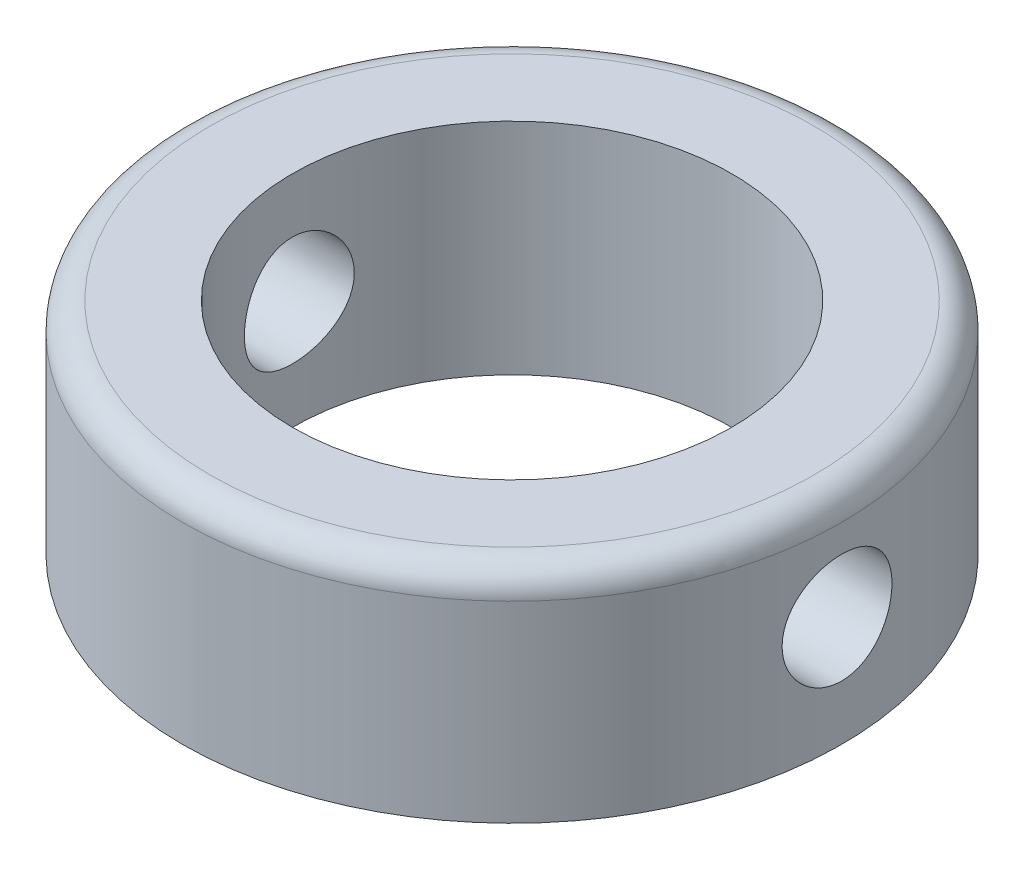
ISO-10303-21;
HEADER;
FILE_DESCRIPTION(('STEP AP214'),'2;1');
FILE_NAME('part.step','',(''),(''),'','','');
FILE_SCHEMA(('AUTOMOTIVE_DESIGN { 1 0 10303 214 1 1 1 1 }'));
ENDSEC;
DATA;
#1=APPLICATION_CONTEXT('core data for automotive mechanical design processes');
#2=APPLICATION_PROTOCOL_DEFINITION('international standard','automotive_design',2000,#1);
#3=PRODUCT_CONTEXT('',#1,'mechanical');
#4=PRODUCT('Part','Part','',(#3));
#5=PRODUCT_RELATED_PRODUCT_CATEGORY('part','',(#4));
#6=PRODUCT_DEFINITION_FORMATION('','',#4);
#7=PRODUCT_DEFINITION_CONTEXT('part definition',#1,'design');
#8=PRODUCT_DEFINITION('design','',#6,#7);
#9=PRODUCT_DEFINITION_SHAPE('','',#8);
#10=(LENGTH_UNIT() NAMED_UNIT(*) SI_UNIT(.MILLI.,.METRE.));
#11=(NAMED_UNIT(*) PLANE_ANGLE_UNIT() SI_UNIT($,.RADIAN.));
#12=(NAMED_UNIT(*) SI_UNIT($,.STERADIAN.) SOLID_ANGLE_UNIT());
#13=UNCERTAINTY_MEASURE_WITH_UNIT(LENGTH_MEASURE(1.E-05),#10,'distance_accuracy_value','');
#14=(GEOMETRIC_REPRESENTATION_CONTEXT(3) GLOBAL_UNCERTAINTY_ASSIGNED_CONTEXT((#13)) GLOBAL_UNIT_ASSIGNED_CONTEXT((#10,
#11,#12)) REPRESENTATION_CONTEXT('',''));
#15=CARTESIAN_POINT('',(0.,0.,0.));
#16=DIRECTION('',(0.,0.,1.));
#17=DIRECTION('',(1.,0.,0.));
#18=AXIS2_PLACEMENT_3D('',#15,#16,#17);
#19=CARTESIAN_POINT('',(0.,4.,0.));
#20=DIRECTION('',(0.,1.,0.));
#21=DIRECTION('',(0.,0.,1.));
#22=AXIS2_PLACEMENT_3D('',#19,#20,#21);
#23=PLANE('',#22);
#24=CARTESIAN_POINT('',(0.,4.,0.));
#25=DIRECTION('',(0.,1.,0.));
#26=DIRECTION('',(0.,0.,1.));
#27=AXIS2_PLACEMENT_3D('',#24,#25,#26);
#28=CIRCLE('',#27,11.);
#29=CARTESIAN_POINT('',(0.,4.,11.));
#30=VERTEX_POINT('',#29);
#31=EDGE_CURVE('E57',#30,#30,#28,.T.);
#32=ORIENTED_EDGE('',*,*,#31,.T.);
#33=EDGE_LOOP('',(#32));
#34=FACE_BOUND('',#33,.T.);
#35=CARTESIAN_POINT('',(0.,4.,0.));
#36=DIRECTION('',(0.,1.,0.));
#37=DIRECTION('',(0.,0.,1.));
#38=AXIS2_PLACEMENT_3D('',#35,#36,#37);
#39=CIRCLE('',#38,8.);
#40=CARTESIAN_POINT('',(0.,4.,8.));
#41=VERTEX_POINT('',#40);
#42=EDGE_CURVE('E114',#41,#41,#39,.T.);
#43=ORIENTED_EDGE('',*,*,#42,.F.);
#44=EDGE_LOOP('',(#43));
#45=FACE_BOUND('',#44,.T.);
#46=ADVANCED_FACE('F43',(#34,#45),#23,.T.);
#47=CARTESIAN_POINT('',(0.,-4.,0.));
#48=DIRECTION('',(0.,1.,0.));
#49=DIRECTION('',(0.,0.,1.));
#50=AXIS2_PLACEMENT_3D('',#47,#48,#49);
#51=PLANE('',#50);
#52=CARTESIAN_POINT('',(0.,-4.,0.));
#53=DIRECTION('',(0.,1.,0.));
#54=DIRECTION('',(0.,0.,1.));
#55=AXIS2_PLACEMENT_3D('',#52,#53,#54);
#56=CIRCLE('',#55,12.);
#57=CARTESIAN_POINT('',(0.,-4.,12.));
#58=VERTEX_POINT('',#57);
#59=EDGE_CURVE('E63',#58,#58,#56,.T.);
#60=ORIENTED_EDGE('',*,*,#59,.F.);
#61=EDGE_LOOP('',(#60));
#62=FACE_BOUND('',#61,.T.);
#63=CARTESIAN_POINT('',(0.,-4.,0.));
#64=DIRECTION('',(0.,1.,0.));
#65=DIRECTION('',(0.,0.,1.));
#66=AXIS2_PLACEMENT_3D('',#63,#64,#65);
#67=CIRCLE('',#66,8.);
#68=CARTESIAN_POINT('',(0.,-4.,8.));
#69=VERTEX_POINT('',#68);
#70=EDGE_CURVE('E117',#69,#69,#67,.T.);
#71=ORIENTED_EDGE('',*,*,#70,.T.);
#72=EDGE_LOOP('',(#71));
#73=FACE_BOUND('',#72,.T.);
#74=ADVANCED_FACE('F100',(#62,#73),#51,.F.);
#75=CARTESIAN_POINT('',(0.,4.,0.));
#76=DIRECTION('',(0.,-1.,0.));
#77=DIRECTION('',(0.,0.,-1.));
#78=AXIS2_PLACEMENT_3D('',#75,#76,#77);
#79=CYLINDRICAL_SURFACE('',#78,12.);
#80=CARTESIAN_POINT('',(-12.,-2.,0.));
#81=CARTESIAN_POINT('',(-11.9999980893506,-1.99999552884175,-0.111512723966572));
#82=CARTESIAN_POINT('',(-11.9984294233043,-1.99064218002486,-0.223086305471057));
#83=CARTESIAN_POINT('',(-11.9923227595311,-1.95349147298774,-0.443104177338434));
#84=CARTESIAN_POINT('',(-11.9877820313911,-1.92567715447072,-0.551545494367397));
#85=CARTESIAN_POINT('',(-11.9762405458916,-1.8524676411258,-0.762083797770115));
#86=CARTESIAN_POINT('',(-11.9692418012735,-1.80708682748754,-0.864185894745521));
#87=CARTESIAN_POINT('',(-11.9535538166566,-1.70007016635808,-1.05931347358236));
#88=CARTESIAN_POINT('',(-11.9448647700355,-1.6384361780136,-1.15233999190287));
#89=CARTESIAN_POINT('',(-11.9266665396665,-1.50003593294363,-1.32757809143334));
#90=CARTESIAN_POINT('',(-11.9171509745189,-1.4231447082911,-1.40969032282797));
#91=CARTESIAN_POINT('',(-11.8984210150139,-1.25668162522175,-1.55991079892794));
#92=CARTESIAN_POINT('',(-11.8892066397013,-1.16710896683471,-1.62801815951278));
#93=CARTESIAN_POINT('',(-11.8720605260782,-0.977143227042356,-1.74869370048411));
#94=CARTESIAN_POINT('',(-11.8641370327331,-0.876686930556196,-1.8011636422888));
#95=CARTESIAN_POINT('',(-11.8505583183574,-0.668232348559499,-1.88844669232898));
#96=CARTESIAN_POINT('',(-11.8449029441145,-0.560234573057895,-1.92326099325249));
#97=CARTESIAN_POINT('',(-11.836564294742,-0.340815780114768,-1.97393150222785));
#98=CARTESIAN_POINT('',(-11.8338541478856,-0.229435410798886,-1.98995922330832));
#99=CARTESIAN_POINT('',(-11.8316315114932,-0.00553577849322258,-2.0031333802319));
#100=CARTESIAN_POINT('',(-11.8321187956577,0.10698340333384,-2.0002811523112));
#101=CARTESIAN_POINT('',(-11.8362114309084,0.328742289020359,-1.97591607871692));
#102=CARTESIAN_POINT('',(-11.8397845865513,0.438003842836187,-1.95459590551182));
#103=CARTESIAN_POINT('',(-11.8495959616881,0.651377054263307,-1.89420251232276));
#104=CARTESIAN_POINT('',(-11.8558342725862,0.755488535110837,-1.85512868345579));
#105=CARTESIAN_POINT('',(-11.8703078346728,0.956183058752735,-1.76014179687513));
#106=CARTESIAN_POINT('',(-11.8785525368586,1.05272752486498,-1.70414873110377));
#107=CARTESIAN_POINT('',(-11.8961033473201,1.23512352043071,-1.57696961404595));
#108=CARTESIAN_POINT('',(-11.9054095412343,1.32097418596395,-1.50578233652343));
#109=CARTESIAN_POINT('',(-11.9241762230383,1.48066086864588,-1.34918576972724));
#110=CARTESIAN_POINT('',(-11.9336371938532,1.55433481483207,-1.2636111710985));
#111=CARTESIAN_POINT('',(-11.9515408111738,1.68630221013227,-1.08122819918532));
#112=CARTESIAN_POINT('',(-11.959983451118,1.74459556014658,-0.984419753525138));
#113=CARTESIAN_POINT('',(-11.9749111431433,1.84416178170903,-0.782164732933369));
#114=CARTESIAN_POINT('',(-11.9813945472596,1.88542033546501,-0.676710980451729));
#115=CARTESIAN_POINT('',(-11.9916600241013,1.94959537219678,-0.460238676482185));
#116=CARTESIAN_POINT('',(-11.9954423228038,1.97251338957897,-0.349220591343574));
#117=CARTESIAN_POINT('',(-11.9998490387415,1.99913708676891,-0.126167921041299));
#118=CARTESIAN_POINT('',(-12.0005100241023,2.00306525744449,-0.0141605897208088));
#119=CARTESIAN_POINT('',(-11.9986997953694,1.9921909244575,0.20891181831191));
#120=CARTESIAN_POINT('',(-11.9962287017929,1.97738914149301,0.319976931113631));
#121=CARTESIAN_POINT('',(-11.9884546155056,1.92966012053162,0.537324940437411));
#122=CARTESIAN_POINT('',(-11.9831688384105,1.8968430332879,0.643632694708303));
#123=CARTESIAN_POINT('',(-11.9703557156429,1.81413238544037,0.849237507888354));
#124=CARTESIAN_POINT('',(-11.9628282440962,1.76423786589178,0.948534172727775));
#125=CARTESIAN_POINT('',(-11.9462761304193,1.64827910024257,1.13826455157517));
#126=CARTESIAN_POINT('',(-11.9372388470962,1.5820758750662,1.22861220074972));
#127=CARTESIAN_POINT('',(-11.9187077391352,1.43557014769195,1.39699486840215));
#128=CARTESIAN_POINT('',(-11.9092138813724,1.35526662137867,1.47502899175727));
#129=CARTESIAN_POINT('',(-11.8907214018868,1.18184196154286,1.6173942237264));
#130=CARTESIAN_POINT('',(-11.8817289290968,1.08859666758847,1.68157500889097));
#131=CARTESIAN_POINT('',(-11.8653722382231,0.892517624689169,1.79336184823599));
#132=CARTESIAN_POINT('',(-11.8580079685282,0.789684179818004,1.84096842781586));
#133=CARTESIAN_POINT('',(-11.8457876295816,0.577768213750295,1.91803066517852));
#134=CARTESIAN_POINT('',(-11.8409212344885,0.46871352397561,1.94756114603836));
#135=CARTESIAN_POINT('',(-11.8342217346821,0.247103896622591,1.98786836302262));
#136=CARTESIAN_POINT('',(-11.8323883662618,0.134549264214359,1.99864672955693));
#137=CARTESIAN_POINT('',(-11.8319738646721,-0.0893641327699268,2.00109829283788));
#138=CARTESIAN_POINT('',(-11.8333524520452,-0.20072030286023,1.99300810890015));
#139=CARTESIAN_POINT('',(-11.8391182516298,-0.420463398440612,1.95846387116548));
#140=CARTESIAN_POINT('',(-11.8435054540897,-0.528850333553497,1.93200987688998));
#141=CARTESIAN_POINT('',(-11.8547788502538,-0.739486749834091,1.86157959167592));
#142=CARTESIAN_POINT('',(-11.8616621377574,-0.841743208044819,1.81762367248035));
#143=CARTESIAN_POINT('',(-11.8771549513777,-1.03746853535588,1.71346160313273));
#144=CARTESIAN_POINT('',(-11.8857645631072,-1.13093696829771,1.65325464699885));
#145=CARTESIAN_POINT('',(-11.903867632365,-1.3076284664862,1.51745510749772));
#146=CARTESIAN_POINT('',(-11.9133703646104,-1.39071681336022,1.44168845087492));
#147=CARTESIAN_POINT('',(-11.9321149788867,-1.54308128357995,1.27728722510418));
#148=CARTESIAN_POINT('',(-11.9413568002124,-1.61235421491054,1.18864969033011));
#149=CARTESIAN_POINT('',(-11.9586122371378,-1.73555861455996,1.00029533571223));
#150=CARTESIAN_POINT('',(-11.9666169300248,-1.78938083145036,0.900506230026255));
#151=CARTESIAN_POINT('',(-11.9804093408142,-1.87941558768794,0.693210455503185));
#152=CARTESIAN_POINT('',(-11.9861992654199,-1.91564566486376,0.585711595864008));
#153=CARTESIAN_POINT('',(-11.9936463266636,-1.96160421930133,0.398162648036321));
#154=CARTESIAN_POINT('',(-11.9960162181869,-1.97597957569277,0.319247064238758));
#155=CARTESIAN_POINT('',(-11.999193727889,-1.9951789902758,0.160231448255847));
#156=CARTESIAN_POINT('',(-12.0000013729651,-2.00000321290989,0.0801314364867954));
#157=CARTESIAN_POINT('',(-12.,-2.,0.));
#158=B_SPLINE_CURVE_WITH_KNOTS('',3,(#80,#81,#82,#83,#84,#85,#86,#87,#88,#89,#90,#91,#92,#93,
#94,#95,#96,#97,#98,#99,#100,#101,#102,#103,#104,#105,#106,#107,#108,#109,#110,#111,#112,#113,
#114,#115,#116,#117,#118,#119,#120,#121,#122,#123,#124,#125,#126,#127,#128,#129,#130,#131,#132,
#133,#134,#135,#136,#137,#138,#139,#140,#141,#142,#143,#144,#145,#146,#147,#148,#149,#150,#151,
#152,#153,#154,#155,#156,#157),.UNSPECIFIED.,.T.,.F.,(4,2,2,2,2,2,2,2,2,2,2,2,2,2,2,2,2,2,2,2,2,
2,2,2,2,2,2,2,2,2,2,2,2,2,2,2,2,2,4),(0.,0.334245267950808,0.668798036556336,1.00307749362022,
1.33731873013983,1.67441992849866,2.01154240135885,2.35074016659072,2.68991501500945,
3.02596861682739,3.36199843456709,3.69456417408327,4.02714132020305,4.36131645306046,
4.69551856544459,5.03386215929061,5.37220793308678,5.71083751132723,6.04943875616919,
6.38406306793118,6.71867450428688,7.05126245605132,7.38386908660853,7.71941460501619,
8.05498450443426,8.39403057606095,8.73306589900754,9.07068817873417,9.40828110229294,
9.7416632761816,10.0750443695051,10.4080385458098,10.7410492402347,11.0780110735471,
11.4150506710318,11.7544178528576,12.0934460170406,12.3336339853121,12.5738178182157),.UNSPECIFIED.);
#159=CARTESIAN_POINT('',(-12.,-2.,0.));
#160=VERTEX_POINT('',#159);
#161=EDGE_CURVE('E91',#160,#160,#158,.T.);
#162=ORIENTED_EDGE('',*,*,#161,.T.);
#163=EDGE_LOOP('',(#162));
#164=FACE_BOUND('',#163,.T.);
#165=CARTESIAN_POINT('',(11.8321595661992,0.,-2.));
#166=CARTESIAN_POINT('',(11.8321615789328,-0.111500598529449,-1.99999551873586));
#167=CARTESIAN_POINT('',(11.8337527390819,-0.223062084857177,-1.99064413522263));
#168=CARTESIAN_POINT('',(11.8399396576003,-0.443054834610535,-1.9535019424531));
#169=CARTESIAN_POINT('',(11.844538186771,-0.551483115006451,-1.92569412824689));
#170=CARTESIAN_POINT('',(11.8562048749385,-0.761993826673285,-1.8525036349364));
#171=CARTESIAN_POINT('',(11.8632709694721,-0.864081478929796,-1.80713564394559));
#172=CARTESIAN_POINT('',(11.8790741768183,-1.05918476377422,-1.70014919751157));
#173=CARTESIAN_POINT('',(11.8878111015538,-1.15220141566186,-1.63853257080106));
#174=CARTESIAN_POINT('',(11.906067769247,-1.32745027979565,-1.50015002157324));
#175=CARTESIAN_POINT('',(11.9155937386236,-1.40958010510897,-1.42325523914587));
#176=CARTESIAN_POINT('',(11.9342998453486,-1.55983464548945,-1.25677760375622));
#177=CARTESIAN_POINT('',(11.9434799621739,-1.62795853049233,-1.16719399931998));
#178=CARTESIAN_POINT('',(11.9605258958617,-1.74865165377542,-0.977218295958686));
#179=CARTESIAN_POINT('',(11.9683835394587,-1.80112560618544,-0.876764865165368));
#180=CARTESIAN_POINT('',(11.9818298956567,-1.88841685642444,-0.668316497379096));
#181=CARTESIAN_POINT('',(11.9874187557813,-1.9232353023079,-0.560322051262552));
#182=CARTESIAN_POINT('',(11.9956538777952,-1.97391402798712,-0.340914981075395));
#183=CARTESIAN_POINT('',(11.9983268248873,-1.98994633280375,-0.229543109343418));
#184=CARTESIAN_POINT('',(12.0005206347422,-2.00313260332208,-0.0056602284206389));
#185=CARTESIAN_POINT('',(12.0000417117545,-2.00028785219779,0.106850702823118));
#186=CARTESIAN_POINT('',(11.9960068674511,-1.97593491877743,0.328641748063099));
#187=CARTESIAN_POINT('',(11.9924814695392,-1.95461186927268,0.437942824560112));
#188=CARTESIAN_POINT('',(11.9827838301731,-1.89419914060281,0.651393583689432));
#189=CARTESIAN_POINT('',(11.9766115081057,-1.8551089203284,0.755543109321202));
#190=CARTESIAN_POINT('',(11.9622615880957,-1.76008748774775,0.956284918226117));
#191=CARTESIAN_POINT('',(11.954074938615,-1.70407999033405,1.05284041841523));
#192=CARTESIAN_POINT('',(11.936605904572,-1.57686974189196,1.23525242387731));
#193=CARTESIAN_POINT('',(11.9273234313531,-1.50566576103135,1.3211080623327));
#194=CARTESIAN_POINT('',(11.9085621458608,-1.34905695470456,1.48077701875733));
#195=CARTESIAN_POINT('',(11.8990823178483,-1.26349032407921,1.55443160180257));
#196=CARTESIAN_POINT('',(11.8811036782784,-1.08113032782734,1.68636367075845));
#197=CARTESIAN_POINT('',(11.8726048757706,-0.984336858653745,1.74464101482593));
#198=CARTESIAN_POINT('',(11.8575500364945,-0.782086686498016,1.84419554759063));
#199=CARTESIAN_POINT('',(11.8509961864208,-0.676620401526328,1.88545362182339));
#200=CARTESIAN_POINT('',(11.840609509519,-0.460120742153965,1.94962389665249));
#201=CARTESIAN_POINT('',(11.8367764431066,-0.349087858854061,1.97253771261436));
#202=CARTESIAN_POINT('',(11.8323116753769,-0.126027075070295,1.99914550790341));
#203=CARTESIAN_POINT('',(11.8316422860694,-0.0140268962383192,2.00306576632995));
#204=CARTESIAN_POINT('',(11.8334802782589,0.209029337352655,1.99217816214597));
#205=CARTESIAN_POINT('',(11.8359875370548,0.320085428411177,1.97737102289973));
#206=CARTESIAN_POINT('',(11.8438614996401,0.537382207352685,1.92964186794248));
#207=CARTESIAN_POINT('',(11.8492100153468,0.643648911902407,1.89683503251711));
#208=CARTESIAN_POINT('',(11.862148584044,0.849176133023588,1.81415855215382));
#209=CARTESIAN_POINT('',(11.8697387711246,0.94843623004072,1.76428788648075));
#210=CARTESIAN_POINT('',(11.8863930271791,1.13813967552489,1.64836533858338));
#211=CARTESIAN_POINT('',(11.8954700448028,1.22849325820485,1.58216845132749));
#212=CARTESIAN_POINT('',(11.9140373334389,1.396890826156,1.43567157256639));
#213=CARTESIAN_POINT('',(11.9235276334827,1.47493394488779,1.35537058910724));
#214=CARTESIAN_POINT('',(11.9419713769461,1.61732151418296,1.18194245626305));
#215=CARTESIAN_POINT('',(11.9509182107574,1.68151506102763,1.08869060270896));
#216=CARTESIAN_POINT('',(11.9671608994635,1.7933242616039,0.892594758359462));
#217=CARTESIAN_POINT('',(11.9744568077598,1.84094045157908,0.789751077976502));
#218=CARTESIAN_POINT('',(11.9865468653567,1.91800846716389,0.577839241201064));
#219=CARTESIAN_POINT('',(11.9913518765409,1.94753926058794,0.468800450082091));
#220=CARTESIAN_POINT('',(11.9979646653543,1.98785247917106,0.24722458789937));
#221=CARTESIAN_POINT('',(11.9997726896015,1.99863644698588,0.134687805457297));
#222=CARTESIAN_POINT('',(12.0001843031025,2.00110550584976,-0.0892330206189402));
#223=CARTESIAN_POINT('',(11.9988264161935,1.99302020315287,-0.200614528482131));
#224=CARTESIAN_POINT('',(11.9931374270987,1.95847686218446,-0.420409579451763));
#225=CARTESIAN_POINT('',(11.9888063415615,1.93201892679226,-0.528823139173983));
#226=CARTESIAN_POINT('',(11.9776559106192,1.86156946756508,-0.73951715673483));
#227=CARTESIAN_POINT('',(11.970839336327,1.81759746543196,-0.841804297723056));
#228=CARTESIAN_POINT('',(11.9554620550242,1.71339365101554,-1.03758436238573));
#229=CARTESIAN_POINT('',(11.9469012653393,1.65316106795004,-1.13107686889458));
#230=CARTESIAN_POINT('',(11.9288610369313,1.5173319260316,-1.30777035642112));
#231=CARTESIAN_POINT('',(11.919372196329,1.441567236199,-1.3908411444822));
#232=CARTESIAN_POINT('',(11.900610426515,1.27717735367695,-1.54317110076073));
#233=CARTESIAN_POINT('',(11.8913375483961,1.18854915286998,-1.61242702936952));
#234=CARTESIAN_POINT('',(11.8739867482713,1.00020374200831,-1.73561141672869));
#235=CARTESIAN_POINT('',(11.8659177427663,0.900412528187612,-1.78942799124616));
#236=CARTESIAN_POINT('',(11.8519936807305,0.693112611329484,-1.87945162912342));
#237=CARTESIAN_POINT('',(11.846136413799,0.585611741858109,-1.91567628417846));
#238=CARTESIAN_POINT('',(11.8385979588519,0.398076984410093,-1.96162084250194));
#239=CARTESIAN_POINT('',(11.8361969873557,0.319178553629914,-1.97598993413711));
#240=CARTESIAN_POINT('',(11.8329770823046,0.16019721213045,-1.99518103614505));
#241=CARTESIAN_POINT('',(11.8321581200295,0.0801143229406407,-2.00000321983422));
#242=CARTESIAN_POINT('',(11.8321595661992,0.,-2.));
#243=B_SPLINE_CURVE_WITH_KNOTS('',3,(#165,#166,#167,#168,#169,#170,#171,#172,#173,#174,#175,
#176,#177,#178,#179,#180,#181,#182,#183,#184,#185,#186,#187,#188,#189,#190,#191,#192,#193,#194,
#195,#196,#197,#198,#199,#200,#201,#202,#203,#204,#205,#206,#207,#208,#209,#210,#211,#212,#213,
#214,#215,#216,#217,#218,#219,#220,#221,#222,#223,#224,#225,#226,#227,#228,#229,#230,#231,#232,
#233,#234,#235,#236,#237,#238,#239,#240,#241,#242),.UNSPECIFIED.,.T.,.F.,(4,2,2,2,2,2,2,2,2,2,2,
2,2,2,2,2,2,2,2,2,2,2,2,2,2,2,2,2,2,2,2,2,2,2,2,2,2,2,4),(0.,0.334208831142192,
0.668726015970375,1.00296399830015,1.33716437924219,1.67431327324572,2.01148214267557,
2.35066384089148,2.6898234808889,3.02585253978052,3.36185875722153,3.69453696931735,
4.02722531399626,4.3614368331154,4.69567540981411,5.03396898769699,5.37226568596815,
5.71094129998883,6.04958708750461,6.38418833936328,6.71877666731181,7.05124851708393,
7.38374025834859,7.71929874210161,8.05488083544551,8.39395290428305,8.73301400381358,
9.07058387534117,9.4081259672988,9.74158221012733,10.0750365857506,10.4081203186597,
10.7412198431387,11.078135979706,11.4151310310545,11.7545098209466,12.0935485339556,
12.3336853643501,12.5738178352145),.UNSPECIFIED.);
#244=CARTESIAN_POINT('',(11.8321595661992,0.,-2.));
#245=VERTEX_POINT('',#244);
#246=EDGE_CURVE('E85',#245,#245,#243,.T.);
#247=ORIENTED_EDGE('',*,*,#246,.T.);
#248=EDGE_LOOP('',(#247));
#249=FACE_BOUND('',#248,.T.);
#250=CARTESIAN_POINT('',(0.,3.,0.));
#251=DIRECTION('',(0.,1.,0.));
#252=DIRECTION('',(0.,0.,1.));
#253=AXIS2_PLACEMENT_3D('',#250,#251,#252);
#254=CIRCLE('',#253,12.);
#255=CARTESIAN_POINT('',(0.,3.,12.));
#256=VERTEX_POINT('',#255);
#257=EDGE_CURVE('E10',#256,#256,#254,.F.);
#258=ORIENTED_EDGE('',*,*,#257,.T.);
#259=EDGE_LOOP('',(#258));
#260=FACE_BOUND('',#259,.T.);
#261=ORIENTED_EDGE('',*,*,#59,.T.);
#262=EDGE_LOOP('',(#261));
#263=FACE_BOUND('',#262,.T.);
#264=ADVANCED_FACE('F96',(#164,#249,#260,#263),#79,.T.);
#265=CARTESIAN_POINT('',(0.,4.,0.));
#266=DIRECTION('',(0.,-1.,0.));
#267=DIRECTION('',(0.,0.,-1.));
#268=AXIS2_PLACEMENT_3D('',#265,#266,#267);
#269=CYLINDRICAL_SURFACE('',#268,8.);
#270=CARTESIAN_POINT('',(-7.74596669241483,0.,-2.));
#271=CARTESIAN_POINT('',(-7.74596880070288,0.110440600741261,-1.99999686287446));
#272=CARTESIAN_POINT('',(-7.74835444811678,0.220915918942818,-1.99082099639812));
#273=CARTESIAN_POINT('',(-7.75761489594051,0.438694062538808,-1.95441850037103));
#274=CARTESIAN_POINT('',(-7.76449230897304,0.545995003574548,-1.92718136539368));
#275=CARTESIAN_POINT('',(-7.7819097967692,0.754242830549745,-1.85559295970563));
#276=CARTESIAN_POINT('',(-7.79244514152366,0.855197724308566,-1.81126378228359));
#277=CARTESIAN_POINT('',(-7.81598553623007,1.04824868203191,-1.70681691300911));
#278=CARTESIAN_POINT('',(-7.82899069102791,1.14034436966417,-1.64669855084855));
#279=CARTESIAN_POINT('',(-7.856325730845,1.31508931620977,-1.5109667418495));
#280=CARTESIAN_POINT('',(-7.87067678098427,1.39751488028004,-1.43506951016324));
#281=CARTESIAN_POINT('',(-7.89890300412235,1.54860911548827,-1.27054565128053));
#282=CARTESIAN_POINT('',(-7.91277813253111,1.6172765004974,-1.18191783534424));
#283=CARTESIAN_POINT('',(-7.93872332416466,1.73982037410502,-0.992916160863163));
#284=CARTESIAN_POINT('',(-7.95076549920474,1.79347711052917,-0.892395660956096));
#285=CARTESIAN_POINT('',(-7.97144649540787,1.88304771532247,-0.683410547434209));
#286=CARTESIAN_POINT('',(-7.98008581867475,1.91896420153241,-0.574947108633551));
#287=CARTESIAN_POINT('',(-7.99283807078544,1.97131826766287,-0.355487007003328));
#288=CARTESIAN_POINT('',(-7.99703915075451,1.98813571546127,-0.24458617563918));
#289=CARTESIAN_POINT('',(-8.00074875285838,2.00300670342044,-0.0214630554102148));
#290=CARTESIAN_POINT('',(-8.00025796877363,2.00106301776768,0.0907590356304556));
#291=CARTESIAN_POINT('',(-7.99470475962828,1.97874011979988,0.310704494344775));
#292=CARTESIAN_POINT('',(-7.98974401872699,1.95877093995691,0.418472431202135));
#293=CARTESIAN_POINT('',(-7.97592669219883,1.9016229839612,0.629076494827373));
#294=CARTESIAN_POINT('',(-7.96706989918753,1.86444329169807,0.731912358740877));
#295=CARTESIAN_POINT('',(-7.94630007760717,1.77359794345035,0.930813407003614));
#296=CARTESIAN_POINT('',(-7.93436015756043,1.7197863642706,1.02680901953301));
#297=CARTESIAN_POINT('',(-7.90871923047719,1.59731545670699,1.20855124468098));
#298=CARTESIAN_POINT('',(-7.89501791721992,1.5286535451515,1.29429607017101));
#299=CARTESIAN_POINT('',(-7.86690971015616,1.3762330064141,1.45554807016991));
#300=CARTESIAN_POINT('',(-7.85249375620734,1.29211608612178,1.5307153581504));
#301=CARTESIAN_POINT('',(-7.82492034813365,1.1123200211678,1.66595275192604));
#302=CARTESIAN_POINT('',(-7.81176295284776,1.0166403364072,1.72602215209203));
#303=CARTESIAN_POINT('',(-7.78816397465319,0.815767972680827,1.8295762580452));
#304=CARTESIAN_POINT('',(-7.77773586980577,0.710531415749443,1.87297913394098));
#305=CARTESIAN_POINT('',(-7.76094912111966,0.493931625538838,1.94137124127268));
#306=CARTESIAN_POINT('',(-7.75458960648175,0.382569708813491,1.96636441310582));
#307=CARTESIAN_POINT('',(-7.74684284831313,0.160032398781503,1.99666371093214));
#308=CARTESIAN_POINT('',(-7.74532871274919,0.0489297653362962,2.0024723791357));
#309=CARTESIAN_POINT('',(-7.74709874784831,-0.172657549262527,1.99561359241244));
#310=CARTESIAN_POINT('',(-7.75038247681013,-0.283142286360993,1.98294783827904));
#311=CARTESIAN_POINT('',(-7.76125665563648,-0.498491411963766,1.93994037115013));
#312=CARTESIAN_POINT('',(-7.768775761875,-0.603418181256675,1.9098912546254));
#313=CARTESIAN_POINT('',(-7.7872057461677,-0.806745166281347,1.8332944653365));
#314=CARTESIAN_POINT('',(-7.79811702598891,-0.905144607244272,1.78674483817004));
#315=CARTESIAN_POINT('',(-7.8223690967461,-1.09475302229388,1.67741653434925));
#316=CARTESIAN_POINT('',(-7.83575334885313,-1.18578307203448,1.6143374030685));
#317=CARTESIAN_POINT('',(-7.86333666457373,-1.35615069024108,1.47412058586891));
#318=CARTESIAN_POINT('',(-7.87753586182776,-1.43548633332006,1.39698058961088));
#319=CARTESIAN_POINT('',(-7.90557922425285,-1.58224883405677,1.22852544196945));
#320=CARTESIAN_POINT('',(-7.91940561649468,-1.64932805003905,1.13690390506319));
#321=CARTESIAN_POINT('',(-7.94477773290987,-1.76714869356099,0.943405365389351));
#322=CARTESIAN_POINT('',(-7.95632357603169,-1.81789097328656,0.841528897915182));
#323=CARTESIAN_POINT('',(-7.9757609259065,-1.90115682762235,0.63111640346218));
#324=CARTESIAN_POINT('',(-7.98367864017925,-1.93381142750325,0.522634762055764));
#325=CARTESIAN_POINT('',(-7.99508234716634,-1.98036826768673,0.301499520637613));
#326=CARTESIAN_POINT('',(-7.99856919514738,-1.99427412699123,0.188846730082481));
#327=CARTESIAN_POINT('',(-8.00068338817612,-2.00273517915108,-0.0341670528866471));
#328=CARTESIAN_POINT('',(-7.99943957759977,-1.99780341819082,-0.144507653932044));
#329=CARTESIAN_POINT('',(-7.99251792914887,-1.9699043454113,-0.362734992829502));
#330=CARTESIAN_POINT('',(-7.98684022314338,-1.94693756997366,-0.470621803561858));
#331=CARTESIAN_POINT('',(-7.97170865707778,-1.88389556045828,-0.680342071289548));
#332=CARTESIAN_POINT('',(-7.96227529004785,-1.84391309337124,-0.782204989161725));
#333=CARTESIAN_POINT('',(-7.94062577827316,-1.74805884196086,-0.977834106083248));
#334=CARTESIAN_POINT('',(-7.92840928277515,-1.69218505465903,-1.07159928253127));
#335=CARTESIAN_POINT('',(-7.90214499360574,-1.56456953200773,-1.25080385684661));
#336=CARTESIAN_POINT('',(-7.88806033883329,-1.49247971419234,-1.33598997659667));
#337=CARTESIAN_POINT('',(-7.85981298114379,-1.33515429604531,-1.49323004054701));
#338=CARTESIAN_POINT('',(-7.84565025934604,-1.24991536777767,-1.56528065015318));
#339=CARTESIAN_POINT('',(-7.81854951691005,-1.06679717162108,-1.69552405294366));
#340=CARTESIAN_POINT('',(-7.80563927346578,-0.968711753269492,-1.75343323883276));
#341=CARTESIAN_POINT('',(-7.78287910989656,-0.763889020250361,-1.85185379317094));
#342=CARTESIAN_POINT('',(-7.77302696466428,-0.657158067812306,-1.8923778195043));
#343=CARTESIAN_POINT('',(-7.75903817501475,-0.458845976329679,-1.94884505714201));
#344=CARTESIAN_POINT('',(-7.75417326006998,-0.368213671227727,-1.96798634119376));
#345=CARTESIAN_POINT('',(-7.7476367716524,-0.185062262004625,-1.99356458514354));
#346=CARTESIAN_POINT('',(-7.74596492578215,-0.0925433195111958,-2.0000026287435));
#347=CARTESIAN_POINT('',(-7.74596669241483,0.,-2.));
#348=B_SPLINE_CURVE_WITH_KNOTS('',3,(#270,#271,#272,#273,#274,#275,#276,#277,#278,#279,#280,
#281,#282,#283,#284,#285,#286,#287,#288,#289,#290,#291,#292,#293,#294,#295,#296,#297,#298,#299,
#300,#301,#302,#303,#304,#305,#306,#307,#308,#309,#310,#311,#312,#313,#314,#315,#316,#317,#318,
#319,#320,#321,#322,#323,#324,#325,#326,#327,#328,#329,#330,#331,#332,#333,#334,#335,#336,#337,
#338,#339,#340,#341,#342,#343,#344,#345,#346,#347),.UNSPECIFIED.,.T.,.F.,(4,2,2,2,2,2,2,2,2,2,2,
2,2,2,2,2,2,2,2,2,2,2,2,2,2,2,2,2,2,2,2,2,2,2,2,2,2,2,4),(0.,0.330981953388909,
0.662156593142933,0.992904581732817,1.32366661404383,1.66099163354381,1.99834817183893,
2.34041197118336,2.68242527877674,3.01751000796277,3.35254518932816,3.68014610151158,
4.00776445379829,4.33834299403556,4.66897908375131,5.00856373257529,5.34816424959842,
5.68941145606722,6.03058560103638,6.36274859809374,6.69488101747042,7.02157924007366,
7.34831617137134,7.68146276687326,8.01466415108036,8.35620264772255,8.69772332575643,
9.03673658245543,9.3756843912723,9.70546756901965,10.0352409390158,10.3632390124777,
10.6912784459046,11.0271767726566,11.3631602525241,11.7054118182895,12.0474137709606,
12.3247826174462,12.6021278008238),.UNSPECIFIED.);
#349=CARTESIAN_POINT('',(-7.74596669241483,0.,-2.));
#350=VERTEX_POINT('',#349);
#351=EDGE_CURVE('E47',#350,#350,#348,.T.);
#352=ORIENTED_EDGE('',*,*,#351,.F.);
#353=EDGE_LOOP('',(#352));
#354=FACE_BOUND('',#353,.T.);
#355=CARTESIAN_POINT('',(7.74596669241483,0.,-2.));
#356=CARTESIAN_POINT('',(7.74596880070288,-0.110440600741261,-1.99999686287446));
#357=CARTESIAN_POINT('',(7.74835444811678,-0.220915918942817,-1.99082099639812));
#358=CARTESIAN_POINT('',(7.75761489594051,-0.438694062538807,-1.95441850037103));
#359=CARTESIAN_POINT('',(7.76449230897304,-0.545995003574548,-1.92718136539368));
#360=CARTESIAN_POINT('',(7.7819097967692,-0.754242830549745,-1.85559295970563));
#361=CARTESIAN_POINT('',(7.79244514152366,-0.855197724308566,-1.81126378228359));
#362=CARTESIAN_POINT('',(7.81598553623007,-1.04824868203191,-1.70681691300911));
#363=CARTESIAN_POINT('',(7.82899069102791,-1.14034436966417,-1.64669855084855));
#364=CARTESIAN_POINT('',(7.856325730845,-1.31508931620977,-1.51096674184951));
#365=CARTESIAN_POINT('',(7.87067678098427,-1.39751488028004,-1.43506951016324));
#366=CARTESIAN_POINT('',(7.89890300412235,-1.54860911548827,-1.27054565128053));
#367=CARTESIAN_POINT('',(7.91277813253111,-1.6172765004974,-1.18191783534425));
#368=CARTESIAN_POINT('',(7.93872332416466,-1.73982037410502,-0.992916160863166));
#369=CARTESIAN_POINT('',(7.95076549920474,-1.79347711052917,-0.892395660956098));
#370=CARTESIAN_POINT('',(7.97144649540787,-1.88304771532247,-0.683410547434211));
#371=CARTESIAN_POINT('',(7.98008581867475,-1.91896420153241,-0.574947108633554));
#372=CARTESIAN_POINT('',(7.99283807078544,-1.97131826766287,-0.355487007003331));
#373=CARTESIAN_POINT('',(7.99703915075451,-1.98813571546127,-0.244586175639182));
#374=CARTESIAN_POINT('',(8.00074875285838,-2.00300670342044,-0.0214630554102167));
#375=CARTESIAN_POINT('',(8.00025796877363,-2.00106301776768,0.0907590356304537));
#376=CARTESIAN_POINT('',(7.99470475962828,-1.97874011979988,0.310704494344774));
#377=CARTESIAN_POINT('',(7.98974401872699,-1.95877093995692,0.418472431202133));
#378=CARTESIAN_POINT('',(7.97592669219883,-1.9016229839612,0.629076494827372));
#379=CARTESIAN_POINT('',(7.96706989918753,-1.86444329169807,0.731912358740875));
#380=CARTESIAN_POINT('',(7.94630007760717,-1.77359794345035,0.930813407003613));
#381=CARTESIAN_POINT('',(7.93436015756043,-1.7197863642706,1.02680901953301));
#382=CARTESIAN_POINT('',(7.90871923047719,-1.59731545670699,1.20855124468098));
#383=CARTESIAN_POINT('',(7.89501791721992,-1.5286535451515,1.29429607017101));
#384=CARTESIAN_POINT('',(7.86690971015616,-1.3762330064141,1.45554807016991));
#385=CARTESIAN_POINT('',(7.85249375620734,-1.29211608612178,1.5307153581504));
#386=CARTESIAN_POINT('',(7.82492034813365,-1.1123200211678,1.66595275192604));
#387=CARTESIAN_POINT('',(7.81176295284776,-1.0166403364072,1.72602215209203));
#388=CARTESIAN_POINT('',(7.78816397465319,-0.815767972680828,1.8295762580452));
#389=CARTESIAN_POINT('',(7.77773586980577,-0.710531415749444,1.87297913394098));
#390=CARTESIAN_POINT('',(7.76094912111966,-0.493931625538839,1.94137124127268));
#391=CARTESIAN_POINT('',(7.75458960648175,-0.382569708813491,1.96636441310582));
#392=CARTESIAN_POINT('',(7.74684284831313,-0.160032398781504,1.99666371093214));
#393=CARTESIAN_POINT('',(7.74532871274919,-0.0489297653362974,2.0024723791357));
#394=CARTESIAN_POINT('',(7.74709874784831,0.172657549262526,1.99561359241244));
#395=CARTESIAN_POINT('',(7.75038247681013,0.283142286360992,1.98294783827904));
#396=CARTESIAN_POINT('',(7.76125665563648,0.498491411963765,1.93994037115013));
#397=CARTESIAN_POINT('',(7.768775761875,0.603418181256674,1.9098912546254));
#398=CARTESIAN_POINT('',(7.7872057461677,0.806745166281345,1.8332944653365));
#399=CARTESIAN_POINT('',(7.79811702598891,0.905144607244271,1.78674483817004));
#400=CARTESIAN_POINT('',(7.8223690967461,1.09475302229388,1.67741653434925));
#401=CARTESIAN_POINT('',(7.83575334885313,1.18578307203448,1.6143374030685));
#402=CARTESIAN_POINT('',(7.86333666457373,1.35615069024108,1.47412058586891));
#403=CARTESIAN_POINT('',(7.87753586182776,1.43548633332006,1.39698058961088));
#404=CARTESIAN_POINT('',(7.90557922425285,1.58224883405676,1.22852544196945));
#405=CARTESIAN_POINT('',(7.91940561649468,1.64932805003905,1.13690390506319));
#406=CARTESIAN_POINT('',(7.94477773290987,1.76714869356099,0.943405365389351));
#407=CARTESIAN_POINT('',(7.95632357603169,1.81789097328656,0.841528897915183));
#408=CARTESIAN_POINT('',(7.9757609259065,1.90115682762235,0.631116403462182));
#409=CARTESIAN_POINT('',(7.98367864017925,1.93381142750325,0.522634762055765));
#410=CARTESIAN_POINT('',(7.99508234716634,1.98036826768673,0.301499520637615));
#411=CARTESIAN_POINT('',(7.99856919514738,1.99427412699123,0.188846730082482));
#412=CARTESIAN_POINT('',(8.00068338817612,2.00273517915108,-0.0341670528866452));
#413=CARTESIAN_POINT('',(7.99943957759977,1.99780341819082,-0.144507653932042));
#414=CARTESIAN_POINT('',(7.99251792914887,1.9699043454113,-0.3627349928295));
#415=CARTESIAN_POINT('',(7.98684022314338,1.94693756997366,-0.470621803561856));
#416=CARTESIAN_POINT('',(7.97170865707778,1.88389556045828,-0.680342071289548));
#417=CARTESIAN_POINT('',(7.96227529004785,1.84391309337124,-0.782204989161726));
#418=CARTESIAN_POINT('',(7.94062577827316,1.74805884196086,-0.977834106083248));
#419=CARTESIAN_POINT('',(7.92840928277515,1.69218505465903,-1.07159928253127));
#420=CARTESIAN_POINT('',(7.90214499360574,1.56456953200773,-1.25080385684661));
#421=CARTESIAN_POINT('',(7.88806033883329,1.49247971419234,-1.33598997659667));
#422=CARTESIAN_POINT('',(7.85981298114379,1.33515429604531,-1.49323004054701));
#423=CARTESIAN_POINT('',(7.84565025934604,1.24991536777767,-1.56528065015318));
#424=CARTESIAN_POINT('',(7.81854951691005,1.06679717162108,-1.69552405294366));
#425=CARTESIAN_POINT('',(7.80563927346578,0.968711753269492,-1.75343323883276));
#426=CARTESIAN_POINT('',(7.78287910989656,0.763889020250362,-1.85185379317094));
#427=CARTESIAN_POINT('',(7.77302696466427,0.657158067812307,-1.8923778195043));
#428=CARTESIAN_POINT('',(7.75903817501475,0.458845976329679,-1.94884505714201));
#429=CARTESIAN_POINT('',(7.75417326006998,0.368213671227727,-1.96798634119376));
#430=CARTESIAN_POINT('',(7.7476367716524,0.185062262004624,-1.99356458514354));
#431=CARTESIAN_POINT('',(7.74596492578215,0.0925433195111956,-2.0000026287435));
#432=CARTESIAN_POINT('',(7.74596669241483,0.,-2.));
#433=B_SPLINE_CURVE_WITH_KNOTS('',3,(#355,#356,#357,#358,#359,#360,#361,#362,#363,#364,#365,
#366,#367,#368,#369,#370,#371,#372,#373,#374,#375,#376,#377,#378,#379,#380,#381,#382,#383,#384,
#385,#386,#387,#388,#389,#390,#391,#392,#393,#394,#395,#396,#397,#398,#399,#400,#401,#402,#403,
#404,#405,#406,#407,#408,#409,#410,#411,#412,#413,#414,#415,#416,#417,#418,#419,#420,#421,#422,
#423,#424,#425,#426,#427,#428,#429,#430,#431,#432),.UNSPECIFIED.,.T.,.F.,(4,2,2,2,2,2,2,2,2,2,2,
2,2,2,2,2,2,2,2,2,2,2,2,2,2,2,2,2,2,2,2,2,2,2,2,2,2,2,4),(0.,0.330981953388909,
0.662156593142932,0.992904581732816,1.32366661404383,1.66099163354381,1.99834817183893,
2.34041197118336,2.68242527877674,3.01751000796277,3.35254518932816,3.68014610151157,
4.00776445379829,4.33834299403555,4.6689790837513,5.00856373257529,5.34816424959841,
5.68941145606722,6.03058560103638,6.36274859809373,6.69488101747041,7.02157924007365,
7.34831617137134,7.68146276687326,8.01466415108035,8.35620264772255,8.69772332575642,
9.03673658245543,9.3756843912723,9.70546756901965,10.0352409390158,10.3632390124777,
10.6912784459046,11.0271767726566,11.3631602525241,11.7054118182895,12.0474137709606,
12.3247826174462,12.6021278008238),.UNSPECIFIED.);
#434=CARTESIAN_POINT('',(7.74596669241483,0.,-2.));
#435=VERTEX_POINT('',#434);
#436=EDGE_CURVE('E66',#435,#435,#433,.T.);
#437=ORIENTED_EDGE('',*,*,#436,.F.);
#438=EDGE_LOOP('',(#437));
#439=FACE_BOUND('',#438,.T.);
#440=ORIENTED_EDGE('',*,*,#42,.T.);
#441=EDGE_LOOP('',(#440));
#442=FACE_BOUND('',#441,.T.);
#443=ORIENTED_EDGE('',*,*,#70,.F.);
#444=EDGE_LOOP('',(#443));
#445=FACE_BOUND('',#444,.T.);
#446=ADVANCED_FACE('F72',(#354,#439,#442,#445),#269,.F.);
#447=CARTESIAN_POINT('',(0.,3.,0.));
#448=DIRECTION('',(0.,1.,0.));
#449=DIRECTION('',(0.,0.,1.));
#450=AXIS2_PLACEMENT_3D('',#447,#448,#449);
#451=TOROIDAL_SURFACE('',#450,11.,1.);
#452=ORIENTED_EDGE('',*,*,#257,.F.);
#453=EDGE_LOOP('',(#452));
#454=FACE_BOUND('',#453,.T.);
#455=ORIENTED_EDGE('',*,*,#31,.F.);
#456=EDGE_LOOP('',(#455));
#457=FACE_BOUND('',#456,.T.);
#458=ADVANCED_FACE('F45',(#454,#457),#451,.T.);
#459=CARTESIAN_POINT('',(-12.,0.,0.));
#460=DIRECTION('',(1.,0.,0.));
#461=DIRECTION('',(0.,0.,-1.));
#462=AXIS2_PLACEMENT_3D('',#459,#460,#461);
#463=CYLINDRICAL_SURFACE('',#462,2.);
#464=ORIENTED_EDGE('',*,*,#436,.T.);
#465=EDGE_LOOP('',(#464));
#466=FACE_BOUND('',#465,.T.);
#467=ORIENTED_EDGE('',*,*,#246,.F.);
#468=EDGE_LOOP('',(#467));
#469=FACE_BOUND('',#468,.T.);
#470=ADVANCED_FACE('F78',(#466,#469),#463,.F.);
#471=ORIENTED_EDGE('',*,*,#351,.T.);
#472=EDGE_LOOP('',(#471));
#473=FACE_BOUND('',#472,.T.);
#474=ORIENTED_EDGE('',*,*,#161,.F.);
#475=EDGE_LOOP('',(#474));
#476=FACE_BOUND('',#475,.T.);
#477=ADVANCED_FACE('F75',(#473,#476),#463,.F.);
#478=CLOSED_SHELL('',(#46,#74,#264,#446,#458,#470,#477));
#479=MANIFOLD_SOLID_BREP('B2',#478);
#480=ADVANCED_BREP_SHAPE_REPRESENTATION('',(#18,#479),#14);
#481=SHAPE_DEFINITION_REPRESENTATION(#9,#480);
ENDSEC;
END-ISO-10303-21;
